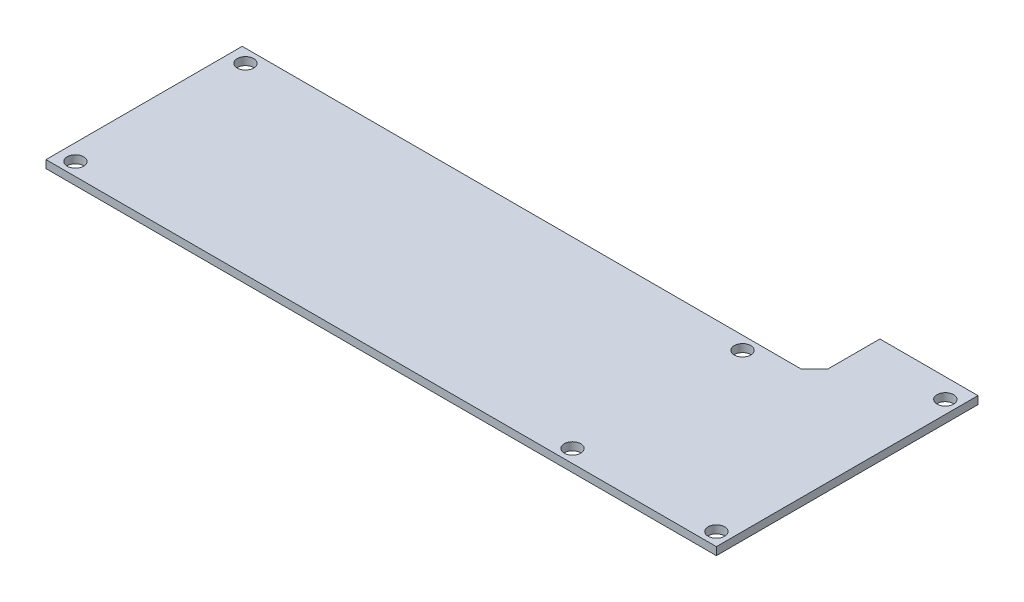
ISO-10303-21;
HEADER;
FILE_DESCRIPTION(('STEP AP214'),'2;1');
FILE_NAME('part.step','',(''),(''),'','','');
FILE_SCHEMA(('AUTOMOTIVE_DESIGN { 1 0 10303 214 1 1 1 1 }'));
ENDSEC;
DATA;
#1=APPLICATION_CONTEXT('core data for automotive mechanical design processes');
#2=APPLICATION_PROTOCOL_DEFINITION('international standard','automotive_design',2000,#1);
#3=PRODUCT_CONTEXT('',#1,'mechanical');
#4=PRODUCT('Part','Part','',(#3));
#5=PRODUCT_RELATED_PRODUCT_CATEGORY('part','',(#4));
#6=PRODUCT_DEFINITION_FORMATION('','',#4);
#7=PRODUCT_DEFINITION_CONTEXT('part definition',#1,'design');
#8=PRODUCT_DEFINITION('design','',#6,#7);
#9=PRODUCT_DEFINITION_SHAPE('','',#8);
#10=(LENGTH_UNIT() NAMED_UNIT(*) SI_UNIT(.MILLI.,.METRE.));
#11=(NAMED_UNIT(*) PLANE_ANGLE_UNIT() SI_UNIT($,.RADIAN.));
#12=(NAMED_UNIT(*) SI_UNIT($,.STERADIAN.) SOLID_ANGLE_UNIT());
#13=UNCERTAINTY_MEASURE_WITH_UNIT(LENGTH_MEASURE(1.E-05),#10,'distance_accuracy_value','');
#14=(GEOMETRIC_REPRESENTATION_CONTEXT(3) GLOBAL_UNCERTAINTY_ASSIGNED_CONTEXT((#13)) GLOBAL_UNIT_ASSIGNED_CONTEXT((#10,
#11,#12)) REPRESENTATION_CONTEXT('',''));
#15=CARTESIAN_POINT('',(0.,0.,0.));
#16=DIRECTION('',(0.,0.,1.));
#17=DIRECTION('',(1.,0.,0.));
#18=AXIS2_PLACEMENT_3D('',#15,#16,#17);
#19=CARTESIAN_POINT('',(65.0875,1.524,-25.4));
#20=DIRECTION('',(0.,-1.,0.));
#21=DIRECTION('',(0.,0.,-1.));
#22=AXIS2_PLACEMENT_3D('',#19,#20,#21);
#23=PLANE('',#22);
#24=CARTESIAN_POINT('',(62.5475,1.524,-21.59));
#25=DIRECTION('',(0.,1.,0.));
#26=DIRECTION('',(0.,0.,1.));
#27=AXIS2_PLACEMENT_3D('',#24,#25,#26);
#28=CIRCLE('',#27,1.59999999999999);
#29=CARTESIAN_POINT('',(62.5475,1.524,-19.99));
#30=VERTEX_POINT('',#29);
#31=EDGE_CURVE('E216',#30,#30,#28,.T.);
#32=ORIENTED_EDGE('',*,*,#31,.F.);
#33=EDGE_LOOP('',(#32));
#34=FACE_BOUND('',#33,.T.);
#35=CARTESIAN_POINT('',(34.6075,1.524,-10.16));
#36=DIRECTION('',(0.,1.,0.));
#37=DIRECTION('',(0.,0.,1.));
#38=AXIS2_PLACEMENT_3D('',#35,#36,#37);
#39=CIRCLE('',#38,1.59999999999999);
#40=CARTESIAN_POINT('',(34.6075,1.524,-8.56000000000001));
#41=VERTEX_POINT('',#40);
#42=EDGE_CURVE('E231',#41,#41,#39,.T.);
#43=ORIENTED_EDGE('',*,*,#42,.F.);
#44=EDGE_LOOP('',(#43));
#45=FACE_BOUND('',#44,.T.);
#46=CARTESIAN_POINT('',(-61.9125,1.524,-10.16));
#47=DIRECTION('',(0.,1.,0.));
#48=DIRECTION('',(0.,0.,1.));
#49=AXIS2_PLACEMENT_3D('',#46,#47,#48);
#50=CIRCLE('',#49,1.59999999999999);
#51=CARTESIAN_POINT('',(-61.9125,1.524,-8.56000000000001));
#52=VERTEX_POINT('',#51);
#53=EDGE_CURVE('E243',#52,#52,#50,.T.);
#54=ORIENTED_EDGE('',*,*,#53,.F.);
#55=EDGE_LOOP('',(#54));
#56=FACE_BOUND('',#55,.T.);
#57=DIRECTION('',(-1.,0.,0.));
#58=VECTOR('',#57,1.);
#59=CARTESIAN_POINT('',(-65.0875,1.524,-25.4));
#60=LINE('',#59,#58);
#61=CARTESIAN_POINT('',(65.0875,1.524,-25.4));
#62=VERTEX_POINT('',#61);
#63=CARTESIAN_POINT('',(46.0375,1.524,-25.4));
#64=VERTEX_POINT('',#63);
#65=EDGE_CURVE('E141',#62,#64,#60,.T.);
#66=ORIENTED_EDGE('',*,*,#65,.T.);
#67=DIRECTION('',(0.,0.,-1.));
#68=VECTOR('',#67,1.);
#69=CARTESIAN_POINT('',(46.0375,1.524,-12.7));
#70=LINE('',#69,#68);
#71=CARTESIAN_POINT('',(46.0375,1.524,-15.24));
#72=VERTEX_POINT('',#71);
#73=EDGE_CURVE('E104',#72,#64,#70,.T.);
#74=ORIENTED_EDGE('',*,*,#73,.F.);
#75=DIRECTION('',(0.707106781186544,0.,-0.707106781186551));
#76=VECTOR('',#75,1.);
#77=CARTESIAN_POINT('',(60.6424999999999,1.524,-29.8450000000001));
#78=LINE('',#77,#76);
#79=CARTESIAN_POINT('',(43.4975,1.524,-12.7));
#80=VERTEX_POINT('',#79);
#81=EDGE_CURVE('E40',#72,#80,#78,.F.);
#82=ORIENTED_EDGE('',*,*,#81,.T.);
#83=DIRECTION('',(1.,0.,0.));
#84=VECTOR('',#83,1.);
#85=CARTESIAN_POINT('',(-65.0875,1.524,-12.7));
#86=LINE('',#85,#84);
#87=CARTESIAN_POINT('',(-65.0875,1.524,-12.7));
#88=VERTEX_POINT('',#87);
#89=EDGE_CURVE('E142',#88,#80,#86,.T.);
#90=ORIENTED_EDGE('',*,*,#89,.F.);
#91=DIRECTION('',(0.,0.,1.));
#92=VECTOR('',#91,1.);
#93=CARTESIAN_POINT('',(-65.0875,1.524,25.4));
#94=LINE('',#93,#92);
#95=CARTESIAN_POINT('',(-65.0875,1.524,25.4));
#96=VERTEX_POINT('',#95);
#97=EDGE_CURVE('E103',#88,#96,#94,.T.);
#98=ORIENTED_EDGE('',*,*,#97,.T.);
#99=DIRECTION('',(1.,0.,0.));
#100=VECTOR('',#99,1.);
#101=CARTESIAN_POINT('',(-65.0875,1.524,25.4));
#102=LINE('',#101,#100);
#103=CARTESIAN_POINT('',(65.0875,1.524,25.4));
#104=VERTEX_POINT('',#103);
#105=EDGE_CURVE('E122',#96,#104,#102,.T.);
#106=ORIENTED_EDGE('',*,*,#105,.T.);
#107=DIRECTION('',(0.,0.,-1.));
#108=VECTOR('',#107,1.);
#109=CARTESIAN_POINT('',(65.0875,1.524,25.4));
#110=LINE('',#109,#108);
#111=EDGE_CURVE('E112',#104,#62,#110,.T.);
#112=ORIENTED_EDGE('',*,*,#111,.T.);
#113=EDGE_LOOP('',(#66,#74,#82,#90,#98,#106,#112));
#114=FACE_BOUND('',#113,.T.);
#115=CARTESIAN_POINT('',(-61.9125,1.524,22.86));
#116=DIRECTION('',(0.,1.,0.));
#117=DIRECTION('',(0.,0.,1.));
#118=AXIS2_PLACEMENT_3D('',#115,#116,#117);
#119=CIRCLE('',#118,1.59999999999999);
#120=CARTESIAN_POINT('',(-61.9125,1.524,24.46));
#121=VERTEX_POINT('',#120);
#122=EDGE_CURVE('E237',#121,#121,#119,.T.);
#123=ORIENTED_EDGE('',*,*,#122,.F.);
#124=EDGE_LOOP('',(#123));
#125=FACE_BOUND('',#124,.T.);
#126=CARTESIAN_POINT('',(34.6075,1.524,22.86));
#127=DIRECTION('',(0.,1.,0.));
#128=DIRECTION('',(0.,0.,1.));
#129=AXIS2_PLACEMENT_3D('',#126,#127,#128);
#130=CIRCLE('',#129,1.59999999999999);
#131=CARTESIAN_POINT('',(34.6075,1.524,24.46));
#132=VERTEX_POINT('',#131);
#133=EDGE_CURVE('E225',#132,#132,#130,.T.);
#134=ORIENTED_EDGE('',*,*,#133,.F.);
#135=EDGE_LOOP('',(#134));
#136=FACE_BOUND('',#135,.T.);
#137=CARTESIAN_POINT('',(62.5475,1.524,22.86));
#138=DIRECTION('',(0.,1.,0.));
#139=DIRECTION('',(0.,0.,1.));
#140=AXIS2_PLACEMENT_3D('',#137,#138,#139);
#141=CIRCLE('',#140,1.59999999999999);
#142=CARTESIAN_POINT('',(62.5475,1.524,24.46));
#143=VERTEX_POINT('',#142);
#144=EDGE_CURVE('E212',#143,#143,#141,.T.);
#145=ORIENTED_EDGE('',*,*,#144,.F.);
#146=EDGE_LOOP('',(#145));
#147=FACE_BOUND('',#146,.T.);
#148=ADVANCED_FACE('F32',(#34,#45,#56,#114,#125,#136,#147),#23,.F.);
#149=CARTESIAN_POINT('',(65.0875,1.524,25.4));
#150=DIRECTION('',(-1.,0.,0.));
#151=DIRECTION('',(0.,0.,1.));
#152=AXIS2_PLACEMENT_3D('',#149,#150,#151);
#153=PLANE('',#152);
#154=DIRECTION('',(0.,0.,-1.));
#155=VECTOR('',#154,1.);
#156=CARTESIAN_POINT('',(65.0875,0.,25.4));
#157=LINE('',#156,#155);
#158=CARTESIAN_POINT('',(65.0875,0.,25.4));
#159=VERTEX_POINT('',#158);
#160=CARTESIAN_POINT('',(65.0875,0.,-25.4));
#161=VERTEX_POINT('',#160);
#162=EDGE_CURVE('E94',#159,#161,#157,.T.);
#163=ORIENTED_EDGE('',*,*,#162,.T.);
#164=DIRECTION('',(0.,-1.,0.));
#165=VECTOR('',#164,1.);
#166=CARTESIAN_POINT('',(65.0875,1.524,-25.4));
#167=LINE('',#166,#165);
#168=EDGE_CURVE('E124',#62,#161,#167,.T.);
#169=ORIENTED_EDGE('',*,*,#168,.F.);
#170=ORIENTED_EDGE('',*,*,#111,.F.);
#171=DIRECTION('',(0.,-1.,0.));
#172=VECTOR('',#171,1.);
#173=CARTESIAN_POINT('',(65.0875,1.524,25.4));
#174=LINE('',#173,#172);
#175=EDGE_CURVE('E118',#104,#159,#174,.T.);
#176=ORIENTED_EDGE('',*,*,#175,.T.);
#177=EDGE_LOOP('',(#163,#169,#170,#176));
#178=FACE_BOUND('',#177,.T.);
#179=ADVANCED_FACE('F154',(#178),#153,.F.);
#180=CARTESIAN_POINT('',(-65.0875,1.524,-25.4));
#181=DIRECTION('',(0.,0.,1.));
#182=DIRECTION('',(1.,0.,0.));
#183=AXIS2_PLACEMENT_3D('',#180,#181,#182);
#184=PLANE('',#183);
#185=DIRECTION('',(-1.,0.,0.));
#186=VECTOR('',#185,1.);
#187=CARTESIAN_POINT('',(-65.0875,0.,-25.4));
#188=LINE('',#187,#186);
#189=CARTESIAN_POINT('',(46.0375,0.,-25.4));
#190=VERTEX_POINT('',#189);
#191=EDGE_CURVE('E110',#161,#190,#188,.T.);
#192=ORIENTED_EDGE('',*,*,#191,.T.);
#193=DIRECTION('',(0.,1.,0.));
#194=VECTOR('',#193,1.);
#195=CARTESIAN_POINT('',(46.0375,-0.000999999999999916,-25.4));
#196=LINE('',#195,#194);
#197=EDGE_CURVE('E95',#190,#64,#196,.T.);
#198=ORIENTED_EDGE('',*,*,#197,.T.);
#199=ORIENTED_EDGE('',*,*,#65,.F.);
#200=ORIENTED_EDGE('',*,*,#168,.T.);
#201=EDGE_LOOP('',(#192,#198,#199,#200));
#202=FACE_BOUND('',#201,.T.);
#203=ADVANCED_FACE('F158',(#202),#184,.F.);
#204=CARTESIAN_POINT('',(-65.0875,1.524,25.4));
#205=DIRECTION('',(1.,0.,0.));
#206=DIRECTION('',(0.,0.,-1.));
#207=AXIS2_PLACEMENT_3D('',#204,#205,#206);
#208=PLANE('',#207);
#209=ORIENTED_EDGE('',*,*,#97,.F.);
#210=DIRECTION('',(0.,1.,0.));
#211=VECTOR('',#210,1.);
#212=CARTESIAN_POINT('',(-65.0875,-0.000999999999999916,-12.7));
#213=LINE('',#212,#211);
#214=CARTESIAN_POINT('',(-65.0875,0.,-12.7));
#215=VERTEX_POINT('',#214);
#216=EDGE_CURVE('E90',#215,#88,#213,.T.);
#217=ORIENTED_EDGE('',*,*,#216,.F.);
#218=DIRECTION('',(0.,0.,1.));
#219=VECTOR('',#218,1.);
#220=CARTESIAN_POINT('',(-65.0875,0.,25.4));
#221=LINE('',#220,#219);
#222=CARTESIAN_POINT('',(-65.0875,0.,25.4));
#223=VERTEX_POINT('',#222);
#224=EDGE_CURVE('E101',#215,#223,#221,.T.);
#225=ORIENTED_EDGE('',*,*,#224,.T.);
#226=DIRECTION('',(0.,-1.,0.));
#227=VECTOR('',#226,1.);
#228=CARTESIAN_POINT('',(-65.0875,1.524,25.4));
#229=LINE('',#228,#227);
#230=EDGE_CURVE('E121',#96,#223,#229,.T.);
#231=ORIENTED_EDGE('',*,*,#230,.F.);
#232=EDGE_LOOP('',(#209,#217,#225,#231));
#233=FACE_BOUND('',#232,.T.);
#234=ADVANCED_FACE('F99',(#233),#208,.F.);
#235=CARTESIAN_POINT('',(-65.0875,1.524,25.4));
#236=DIRECTION('',(0.,0.,-1.));
#237=DIRECTION('',(-1.,0.,0.));
#238=AXIS2_PLACEMENT_3D('',#235,#236,#237);
#239=PLANE('',#238);
#240=DIRECTION('',(1.,0.,0.));
#241=VECTOR('',#240,1.);
#242=CARTESIAN_POINT('',(-65.0875,0.,25.4));
#243=LINE('',#242,#241);
#244=EDGE_CURVE('E109',#223,#159,#243,.T.);
#245=ORIENTED_EDGE('',*,*,#244,.T.);
#246=ORIENTED_EDGE('',*,*,#175,.F.);
#247=ORIENTED_EDGE('',*,*,#105,.F.);
#248=ORIENTED_EDGE('',*,*,#230,.T.);
#249=EDGE_LOOP('',(#245,#246,#247,#248));
#250=FACE_BOUND('',#249,.T.);
#251=ADVANCED_FACE('F161',(#250),#239,.F.);
#252=CARTESIAN_POINT('',(65.0875,0.,-25.4));
#253=DIRECTION('',(0.,-1.,0.));
#254=DIRECTION('',(0.,0.,-1.));
#255=AXIS2_PLACEMENT_3D('',#252,#253,#254);
#256=PLANE('',#255);
#257=CARTESIAN_POINT('',(62.5475,0.,22.86));
#258=DIRECTION('',(0.,-1.,0.));
#259=DIRECTION('',(0.,0.,-1.));
#260=AXIS2_PLACEMENT_3D('',#257,#258,#259);
#261=CIRCLE('',#260,1.6);
#262=CARTESIAN_POINT('',(62.5475,0.,21.26));
#263=VERTEX_POINT('',#262);
#264=EDGE_CURVE('E215',#263,#263,#261,.T.);
#265=ORIENTED_EDGE('',*,*,#264,.F.);
#266=EDGE_LOOP('',(#265));
#267=FACE_BOUND('',#266,.T.);
#268=CARTESIAN_POINT('',(62.5475,0.,-21.59));
#269=DIRECTION('',(0.,-1.,0.));
#270=DIRECTION('',(0.,0.,-1.));
#271=AXIS2_PLACEMENT_3D('',#268,#269,#270);
#272=CIRCLE('',#271,1.6);
#273=CARTESIAN_POINT('',(62.5475,0.,-23.19));
#274=VERTEX_POINT('',#273);
#275=EDGE_CURVE('E219',#274,#274,#272,.T.);
#276=ORIENTED_EDGE('',*,*,#275,.F.);
#277=EDGE_LOOP('',(#276));
#278=FACE_BOUND('',#277,.T.);
#279=CARTESIAN_POINT('',(34.6075,0.,22.86));
#280=DIRECTION('',(0.,-1.,0.));
#281=DIRECTION('',(0.,0.,-1.));
#282=AXIS2_PLACEMENT_3D('',#279,#280,#281);
#283=CIRCLE('',#282,1.59999999999999);
#284=CARTESIAN_POINT('',(34.6075,0.,21.26));
#285=VERTEX_POINT('',#284);
#286=EDGE_CURVE('E228',#285,#285,#283,.T.);
#287=ORIENTED_EDGE('',*,*,#286,.F.);
#288=EDGE_LOOP('',(#287));
#289=FACE_BOUND('',#288,.T.);
#290=CARTESIAN_POINT('',(34.6075,0.,-10.16));
#291=DIRECTION('',(0.,-1.,0.));
#292=DIRECTION('',(0.,0.,-1.));
#293=AXIS2_PLACEMENT_3D('',#290,#291,#292);
#294=CIRCLE('',#293,1.59999999999999);
#295=CARTESIAN_POINT('',(34.6075,0.,-11.76));
#296=VERTEX_POINT('',#295);
#297=EDGE_CURVE('E234',#296,#296,#294,.T.);
#298=ORIENTED_EDGE('',*,*,#297,.F.);
#299=EDGE_LOOP('',(#298));
#300=FACE_BOUND('',#299,.T.);
#301=CARTESIAN_POINT('',(-61.9125,0.,22.86));
#302=DIRECTION('',(0.,-1.,0.));
#303=DIRECTION('',(0.,0.,-1.));
#304=AXIS2_PLACEMENT_3D('',#301,#302,#303);
#305=CIRCLE('',#304,1.59999999999999);
#306=CARTESIAN_POINT('',(-61.9125,0.,21.26));
#307=VERTEX_POINT('',#306);
#308=EDGE_CURVE('E240',#307,#307,#305,.T.);
#309=ORIENTED_EDGE('',*,*,#308,.F.);
#310=EDGE_LOOP('',(#309));
#311=FACE_BOUND('',#310,.T.);
#312=CARTESIAN_POINT('',(-61.9125,0.,-10.16));
#313=DIRECTION('',(0.,-1.,0.));
#314=DIRECTION('',(0.,0.,-1.));
#315=AXIS2_PLACEMENT_3D('',#312,#313,#314);
#316=CIRCLE('',#315,1.59999999999999);
#317=CARTESIAN_POINT('',(-61.9125,0.,-11.76));
#318=VERTEX_POINT('',#317);
#319=EDGE_CURVE('E246',#318,#318,#316,.T.);
#320=ORIENTED_EDGE('',*,*,#319,.F.);
#321=EDGE_LOOP('',(#320));
#322=FACE_BOUND('',#321,.T.);
#323=DIRECTION('',(1.,0.,0.));
#324=VECTOR('',#323,1.);
#325=CARTESIAN_POINT('',(-65.0875,0.,-12.7));
#326=LINE('',#325,#324);
#327=CARTESIAN_POINT('',(43.4975,0.,-12.7));
#328=VERTEX_POINT('',#327);
#329=EDGE_CURVE('E87',#215,#328,#326,.T.);
#330=ORIENTED_EDGE('',*,*,#329,.T.);
#331=DIRECTION('',(-0.707106781186544,0.,0.707106781186551));
#332=VECTOR('',#331,1.);
#333=CARTESIAN_POINT('',(46.0375,0.,-15.24));
#334=LINE('',#333,#332);
#335=CARTESIAN_POINT('',(46.0375,0.,-15.24));
#336=VERTEX_POINT('',#335);
#337=EDGE_CURVE('E11',#328,#336,#334,.F.);
#338=ORIENTED_EDGE('',*,*,#337,.T.);
#339=DIRECTION('',(0.,0.,-1.));
#340=VECTOR('',#339,1.);
#341=CARTESIAN_POINT('',(46.0375,0.,-12.7));
#342=LINE('',#341,#340);
#343=EDGE_CURVE('E136',#336,#190,#342,.T.);
#344=ORIENTED_EDGE('',*,*,#343,.T.);
#345=ORIENTED_EDGE('',*,*,#191,.F.);
#346=ORIENTED_EDGE('',*,*,#162,.F.);
#347=ORIENTED_EDGE('',*,*,#244,.F.);
#348=ORIENTED_EDGE('',*,*,#224,.F.);
#349=EDGE_LOOP('',(#330,#338,#344,#345,#346,#347,#348));
#350=FACE_BOUND('',#349,.T.);
#351=ADVANCED_FACE('F107',(#267,#278,#289,#300,#311,#322,#350),#256,.T.);
#352=CARTESIAN_POINT('',(46.0375,-0.000999999999999916,-12.7));
#353=DIRECTION('',(1.,0.,0.));
#354=DIRECTION('',(0.,0.,-1.));
#355=AXIS2_PLACEMENT_3D('',#352,#353,#354);
#356=PLANE('',#355);
#357=ORIENTED_EDGE('',*,*,#343,.F.);
#358=DIRECTION('',(0.,1.,0.));
#359=VECTOR('',#358,1.);
#360=CARTESIAN_POINT('',(46.0375,1.524,-15.24));
#361=LINE('',#360,#359);
#362=EDGE_CURVE('E127',#336,#72,#361,.T.);
#363=ORIENTED_EDGE('',*,*,#362,.T.);
#364=ORIENTED_EDGE('',*,*,#73,.T.);
#365=ORIENTED_EDGE('',*,*,#197,.F.);
#366=EDGE_LOOP('',(#357,#363,#364,#365));
#367=FACE_BOUND('',#366,.T.);
#368=ADVANCED_FACE('F133',(#367),#356,.F.);
#369=CARTESIAN_POINT('',(-65.0875,-0.000999999999999916,-12.7));
#370=DIRECTION('',(0.,0.,1.));
#371=DIRECTION('',(1.,0.,0.));
#372=AXIS2_PLACEMENT_3D('',#369,#370,#371);
#373=PLANE('',#372);
#374=ORIENTED_EDGE('',*,*,#89,.T.);
#375=DIRECTION('',(0.,-1.,0.));
#376=VECTOR('',#375,1.);
#377=CARTESIAN_POINT('',(43.4975,0.,-12.7));
#378=LINE('',#377,#376);
#379=EDGE_CURVE('E47',#80,#328,#378,.T.);
#380=ORIENTED_EDGE('',*,*,#379,.T.);
#381=ORIENTED_EDGE('',*,*,#329,.F.);
#382=ORIENTED_EDGE('',*,*,#216,.T.);
#383=EDGE_LOOP('',(#374,#380,#381,#382));
#384=FACE_BOUND('',#383,.T.);
#385=ADVANCED_FACE('F89',(#384),#373,.F.);
#386=CARTESIAN_POINT('',(46.0375,-0.000999999999999916,-15.24));
#387=DIRECTION('',(-0.707106781186551,0.,-0.707106781186544));
#388=DIRECTION('',(-0.707106781186544,0.,0.707106781186551));
#389=AXIS2_PLACEMENT_3D('',#386,#387,#388);
#390=PLANE('',#389);
#391=ORIENTED_EDGE('',*,*,#337,.F.);
#392=ORIENTED_EDGE('',*,*,#379,.F.);
#393=ORIENTED_EDGE('',*,*,#81,.F.);
#394=ORIENTED_EDGE('',*,*,#362,.F.);
#395=EDGE_LOOP('',(#391,#392,#393,#394));
#396=FACE_BOUND('',#395,.T.);
#397=ADVANCED_FACE('F34',(#396),#390,.T.);
#398=CARTESIAN_POINT('',(-61.9125,1.524,-10.16));
#399=DIRECTION('',(0.,1.,0.));
#400=DIRECTION('',(0.,0.,1.));
#401=AXIS2_PLACEMENT_3D('',#398,#399,#400);
#402=CYLINDRICAL_SURFACE('',#401,1.59999999999999);
#403=ORIENTED_EDGE('',*,*,#53,.T.);
#404=EDGE_LOOP('',(#403));
#405=FACE_BOUND('',#404,.T.);
#406=ORIENTED_EDGE('',*,*,#319,.T.);
#407=EDGE_LOOP('',(#406));
#408=FACE_BOUND('',#407,.T.);
#409=ADVANCED_FACE('F184',(#405,#408),#402,.F.);
#410=CARTESIAN_POINT('',(-61.9125,1.524,22.86));
#411=DIRECTION('',(0.,1.,0.));
#412=DIRECTION('',(0.,0.,1.));
#413=AXIS2_PLACEMENT_3D('',#410,#411,#412);
#414=CYLINDRICAL_SURFACE('',#413,1.59999999999999);
#415=ORIENTED_EDGE('',*,*,#122,.T.);
#416=EDGE_LOOP('',(#415));
#417=FACE_BOUND('',#416,.T.);
#418=ORIENTED_EDGE('',*,*,#308,.T.);
#419=EDGE_LOOP('',(#418));
#420=FACE_BOUND('',#419,.T.);
#421=ADVANCED_FACE('F187',(#417,#420),#414,.F.);
#422=CARTESIAN_POINT('',(34.6075,1.524,-10.16));
#423=DIRECTION('',(0.,1.,0.));
#424=DIRECTION('',(0.,0.,1.));
#425=AXIS2_PLACEMENT_3D('',#422,#423,#424);
#426=CYLINDRICAL_SURFACE('',#425,1.59999999999999);
#427=ORIENTED_EDGE('',*,*,#42,.T.);
#428=EDGE_LOOP('',(#427));
#429=FACE_BOUND('',#428,.T.);
#430=ORIENTED_EDGE('',*,*,#297,.T.);
#431=EDGE_LOOP('',(#430));
#432=FACE_BOUND('',#431,.T.);
#433=ADVANCED_FACE('F191',(#429,#432),#426,.F.);
#434=CARTESIAN_POINT('',(34.6075,1.524,22.86));
#435=DIRECTION('',(0.,1.,0.));
#436=DIRECTION('',(0.,0.,1.));
#437=AXIS2_PLACEMENT_3D('',#434,#435,#436);
#438=CYLINDRICAL_SURFACE('',#437,1.59999999999999);
#439=ORIENTED_EDGE('',*,*,#133,.T.);
#440=EDGE_LOOP('',(#439));
#441=FACE_BOUND('',#440,.T.);
#442=ORIENTED_EDGE('',*,*,#286,.T.);
#443=EDGE_LOOP('',(#442));
#444=FACE_BOUND('',#443,.T.);
#445=ADVANCED_FACE('F195',(#441,#444),#438,.F.);
#446=CARTESIAN_POINT('',(62.5475,1.524,-21.59));
#447=DIRECTION('',(0.,1.,0.));
#448=DIRECTION('',(0.,0.,1.));
#449=AXIS2_PLACEMENT_3D('',#446,#447,#448);
#450=CYLINDRICAL_SURFACE('',#449,1.6);
#451=ORIENTED_EDGE('',*,*,#31,.T.);
#452=EDGE_LOOP('',(#451));
#453=FACE_BOUND('',#452,.T.);
#454=ORIENTED_EDGE('',*,*,#275,.T.);
#455=EDGE_LOOP('',(#454));
#456=FACE_BOUND('',#455,.T.);
#457=ADVANCED_FACE('F199',(#453,#456),#450,.F.);
#458=CARTESIAN_POINT('',(62.5475,1.524,22.86));
#459=DIRECTION('',(0.,1.,0.));
#460=DIRECTION('',(0.,0.,1.));
#461=AXIS2_PLACEMENT_3D('',#458,#459,#460);
#462=CYLINDRICAL_SURFACE('',#461,1.6);
#463=ORIENTED_EDGE('',*,*,#144,.T.);
#464=EDGE_LOOP('',(#463));
#465=FACE_BOUND('',#464,.T.);
#466=ORIENTED_EDGE('',*,*,#264,.T.);
#467=EDGE_LOOP('',(#466));
#468=FACE_BOUND('',#467,.T.);
#469=ADVANCED_FACE('F203',(#465,#468),#462,.F.);
#470=CLOSED_SHELL('',(#148,#179,#203,#234,#251,#351,#368,#385,#397,#409,#421,#433,#445,#457,#469));
#471=MANIFOLD_SOLID_BREP('B2',#470);
#472=ADVANCED_BREP_SHAPE_REPRESENTATION('',(#18,#471),#14);
#473=SHAPE_DEFINITION_REPRESENTATION(#9,#472);
ENDSEC;
END-ISO-10303-21;
